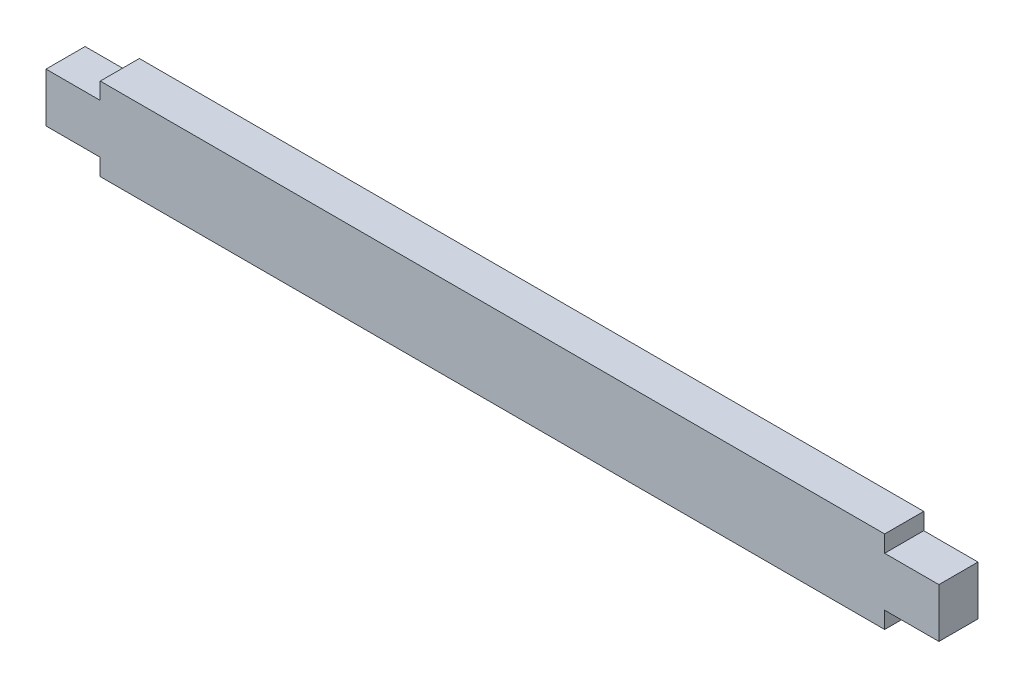
ISO-10303-21;
HEADER;
FILE_DESCRIPTION(('STEP AP214'),'2;1');
FILE_NAME('part.step','',(''),(''),'','','');
FILE_SCHEMA(('AUTOMOTIVE_DESIGN { 1 0 10303 214 1 1 1 1 }'));
ENDSEC;
DATA;
#1=APPLICATION_CONTEXT('core data for automotive mechanical design processes');
#2=APPLICATION_PROTOCOL_DEFINITION('international standard','automotive_design',2000,#1);
#3=PRODUCT_CONTEXT('',#1,'mechanical');
#4=PRODUCT('Part','Part','',(#3));
#5=PRODUCT_RELATED_PRODUCT_CATEGORY('part','',(#4));
#6=PRODUCT_DEFINITION_FORMATION('','',#4);
#7=PRODUCT_DEFINITION_CONTEXT('part definition',#1,'design');
#8=PRODUCT_DEFINITION('design','',#6,#7);
#9=PRODUCT_DEFINITION_SHAPE('','',#8);
#10=(LENGTH_UNIT() NAMED_UNIT(*) SI_UNIT(.MILLI.,.METRE.));
#11=(NAMED_UNIT(*) PLANE_ANGLE_UNIT() SI_UNIT($,.RADIAN.));
#12=(NAMED_UNIT(*) SI_UNIT($,.STERADIAN.) SOLID_ANGLE_UNIT());
#13=UNCERTAINTY_MEASURE_WITH_UNIT(LENGTH_MEASURE(1.E-05),#10,'distance_accuracy_value','');
#14=(GEOMETRIC_REPRESENTATION_CONTEXT(3) GLOBAL_UNCERTAINTY_ASSIGNED_CONTEXT((#13)) GLOBAL_UNIT_ASSIGNED_CONTEXT((#10,
#11,#12)) REPRESENTATION_CONTEXT('',''));
#15=CARTESIAN_POINT('',(0.,0.,0.));
#16=DIRECTION('',(0.,0.,1.));
#17=DIRECTION('',(1.,0.,0.));
#18=AXIS2_PLACEMENT_3D('',#15,#16,#17);
#19=CARTESIAN_POINT('',(-60.185082852189,229.736923892815,43.4894134590924));
#20=DIRECTION('',(1.,0.,0.));
#21=DIRECTION('',(0.,0.,-1.));
#22=AXIS2_PLACEMENT_3D('',#19,#20,#21);
#23=PLANE('',#22);
#24=DIRECTION('',(0.,-1.,0.));
#25=VECTOR('',#24,1.);
#26=CARTESIAN_POINT('',(-60.185082852189,229.736923892815,37.4894134590924));
#27=LINE('',#26,#25);
#28=CARTESIAN_POINT('',(-60.185082852189,232.306808403872,37.4894134590924));
#29=VERTEX_POINT('',#28);
#30=CARTESIAN_POINT('',(-60.185082852189,229.736923892815,37.4894134590924));
#31=VERTEX_POINT('',#30);
#32=EDGE_CURVE('E153',#29,#31,#27,.T.);
#33=ORIENTED_EDGE('',*,*,#32,.T.);
#34=DIRECTION('',(0.,0.,-1.));
#35=VECTOR('',#34,1.);
#36=CARTESIAN_POINT('',(-60.185082852189,229.736923892815,43.4894134590924));
#37=LINE('',#36,#35);
#38=CARTESIAN_POINT('',(-60.185082852189,229.736923892815,43.4894134590924));
#39=VERTEX_POINT('',#38);
#40=EDGE_CURVE('E11',#39,#31,#37,.T.);
#41=ORIENTED_EDGE('',*,*,#40,.F.);
#42=DIRECTION('',(0.,-1.,0.));
#43=VECTOR('',#42,1.);
#44=CARTESIAN_POINT('',(-60.185082852189,229.736923892815,43.4894134590924));
#45=LINE('',#44,#43);
#46=CARTESIAN_POINT('',(-60.185082852189,232.306808403872,43.4894134590924));
#47=VERTEX_POINT('',#46);
#48=EDGE_CURVE('E175',#47,#39,#45,.T.);
#49=ORIENTED_EDGE('',*,*,#48,.F.);
#50=DIRECTION('',(0.,0.,-1.));
#51=VECTOR('',#50,1.);
#52=CARTESIAN_POINT('',(-60.185082852189,232.306808403872,43.4894134590924));
#53=LINE('',#52,#51);
#54=EDGE_CURVE('E149',#47,#29,#53,.T.);
#55=ORIENTED_EDGE('',*,*,#54,.T.);
#56=EDGE_LOOP('',(#33,#41,#49,#55));
#57=FACE_BOUND('',#56,.T.);
#58=ADVANCED_FACE('F33',(#57),#23,.F.);
#59=CARTESIAN_POINT('',(-68.5096381518591,229.736923892815,43.4894134590924));
#60=DIRECTION('',(0.,-1.,0.));
#61=DIRECTION('',(0.,0.,-1.));
#62=AXIS2_PLACEMENT_3D('',#59,#60,#61);
#63=PLANE('',#62);
#64=DIRECTION('',(-1.,0.,0.));
#65=VECTOR('',#64,1.);
#66=CARTESIAN_POINT('',(-68.5096381518591,229.736923892815,37.4894134590924));
#67=LINE('',#66,#65);
#68=CARTESIAN_POINT('',(-68.5096381518591,229.736923892815,37.4894134590924));
#69=VERTEX_POINT('',#68);
#70=EDGE_CURVE('E156',#31,#69,#67,.T.);
#71=ORIENTED_EDGE('',*,*,#70,.T.);
#72=DIRECTION('',(0.,0.,-1.));
#73=VECTOR('',#72,1.);
#74=CARTESIAN_POINT('',(-68.5096381518591,229.736923892815,43.4894134590924));
#75=LINE('',#74,#73);
#76=CARTESIAN_POINT('',(-68.5096381518591,229.736923892815,43.4894134590924));
#77=VERTEX_POINT('',#76);
#78=EDGE_CURVE('E41',#77,#69,#75,.T.);
#79=ORIENTED_EDGE('',*,*,#78,.F.);
#80=DIRECTION('',(-1.,0.,0.));
#81=VECTOR('',#80,1.);
#82=CARTESIAN_POINT('',(-68.5096381518591,229.736923892815,43.4894134590924));
#83=LINE('',#82,#81);
#84=EDGE_CURVE('E104',#39,#77,#83,.T.);
#85=ORIENTED_EDGE('',*,*,#84,.F.);
#86=ORIENTED_EDGE('',*,*,#40,.T.);
#87=EDGE_LOOP('',(#71,#79,#85,#86));
#88=FACE_BOUND('',#87,.T.);
#89=ADVANCED_FACE('F253',(#88),#63,.F.);
#90=CARTESIAN_POINT('',(-68.5096381518591,222.17669291493,43.4894134590924));
#91=DIRECTION('',(1.,0.,0.));
#92=DIRECTION('',(0.,0.,-1.));
#93=AXIS2_PLACEMENT_3D('',#90,#91,#92);
#94=PLANE('',#93);
#95=DIRECTION('',(0.,-1.,0.));
#96=VECTOR('',#95,1.);
#97=CARTESIAN_POINT('',(-68.5096381518591,222.17669291493,37.4894134590924));
#98=LINE('',#97,#96);
#99=CARTESIAN_POINT('',(-68.5096381518591,222.17669291493,37.4894134590924));
#100=VERTEX_POINT('',#99);
#101=EDGE_CURVE('E158',#69,#100,#98,.T.);
#102=ORIENTED_EDGE('',*,*,#101,.T.);
#103=DIRECTION('',(0.,0.,-1.));
#104=VECTOR('',#103,1.);
#105=CARTESIAN_POINT('',(-68.5096381518591,222.17669291493,43.4894134590924));
#106=LINE('',#105,#104);
#107=CARTESIAN_POINT('',(-68.5096381518591,222.17669291493,43.4894134590924));
#108=VERTEX_POINT('',#107);
#109=EDGE_CURVE('E194',#108,#100,#106,.T.);
#110=ORIENTED_EDGE('',*,*,#109,.F.);
#111=DIRECTION('',(0.,-1.,0.));
#112=VECTOR('',#111,1.);
#113=CARTESIAN_POINT('',(-68.5096381518591,222.17669291493,43.4894134590924));
#114=LINE('',#113,#112);
#115=EDGE_CURVE('E202',#77,#108,#114,.T.);
#116=ORIENTED_EDGE('',*,*,#115,.F.);
#117=ORIENTED_EDGE('',*,*,#78,.T.);
#118=EDGE_LOOP('',(#102,#110,#116,#117));
#119=FACE_BOUND('',#118,.T.);
#120=ADVANCED_FACE('F200',(#119),#94,.F.);
#121=CARTESIAN_POINT('',(-60.185082852189,222.17669291493,43.4894134590924));
#122=DIRECTION('',(0.,1.,0.));
#123=DIRECTION('',(0.,0.,1.));
#124=AXIS2_PLACEMENT_3D('',#121,#122,#123);
#125=PLANE('',#124);
#126=DIRECTION('',(1.,0.,0.));
#127=VECTOR('',#126,1.);
#128=CARTESIAN_POINT('',(-60.185082852189,222.17669291493,37.4894134590924));
#129=LINE('',#128,#127);
#130=CARTESIAN_POINT('',(-60.185082852189,222.17669291493,37.4894134590924));
#131=VERTEX_POINT('',#130);
#132=EDGE_CURVE('E160',#100,#131,#129,.T.);
#133=ORIENTED_EDGE('',*,*,#132,.T.);
#134=DIRECTION('',(0.,0.,-1.));
#135=VECTOR('',#134,1.);
#136=CARTESIAN_POINT('',(-60.185082852189,222.17669291493,43.4894134590924));
#137=LINE('',#136,#135);
#138=CARTESIAN_POINT('',(-60.185082852189,222.17669291493,43.4894134590924));
#139=VERTEX_POINT('',#138);
#140=EDGE_CURVE('E191',#139,#131,#137,.T.);
#141=ORIENTED_EDGE('',*,*,#140,.F.);
#142=DIRECTION('',(1.,0.,0.));
#143=VECTOR('',#142,1.);
#144=CARTESIAN_POINT('',(-60.185082852189,222.17669291493,43.4894134590924));
#145=LINE('',#144,#143);
#146=EDGE_CURVE('E220',#108,#139,#145,.T.);
#147=ORIENTED_EDGE('',*,*,#146,.F.);
#148=ORIENTED_EDGE('',*,*,#109,.T.);
#149=EDGE_LOOP('',(#133,#141,#147,#148));
#150=FACE_BOUND('',#149,.T.);
#151=ADVANCED_FACE('F211',(#150),#125,.F.);
#152=CARTESIAN_POINT('',(-60.185082852189,219.606808403872,43.4894134590924));
#153=DIRECTION('',(1.,0.,0.));
#154=DIRECTION('',(0.,0.,-1.));
#155=AXIS2_PLACEMENT_3D('',#152,#153,#154);
#156=PLANE('',#155);
#157=DIRECTION('',(0.,-1.,0.));
#158=VECTOR('',#157,1.);
#159=CARTESIAN_POINT('',(-60.185082852189,219.606808403872,37.4894134590924));
#160=LINE('',#159,#158);
#161=CARTESIAN_POINT('',(-60.185082852189,219.606808403872,37.4894134590924));
#162=VERTEX_POINT('',#161);
#163=EDGE_CURVE('E162',#131,#162,#160,.T.);
#164=ORIENTED_EDGE('',*,*,#163,.T.);
#165=DIRECTION('',(0.,0.,-1.));
#166=VECTOR('',#165,1.);
#167=CARTESIAN_POINT('',(-60.185082852189,219.606808403872,43.4894134590924));
#168=LINE('',#167,#166);
#169=CARTESIAN_POINT('',(-60.185082852189,219.606808403872,43.4894134590924));
#170=VERTEX_POINT('',#169);
#171=EDGE_CURVE('E188',#170,#162,#168,.T.);
#172=ORIENTED_EDGE('',*,*,#171,.F.);
#173=DIRECTION('',(0.,-1.,0.));
#174=VECTOR('',#173,1.);
#175=CARTESIAN_POINT('',(-60.185082852189,219.606808403872,43.4894134590924));
#176=LINE('',#175,#174);
#177=EDGE_CURVE('E217',#139,#170,#176,.T.);
#178=ORIENTED_EDGE('',*,*,#177,.F.);
#179=ORIENTED_EDGE('',*,*,#140,.T.);
#180=EDGE_LOOP('',(#164,#172,#178,#179));
#181=FACE_BOUND('',#180,.T.);
#182=ADVANCED_FACE('F215',(#181),#156,.F.);
#183=CARTESIAN_POINT('',(-60.185082852189,219.606808403872,43.4894134590924));
#184=DIRECTION('',(0.,1.,0.));
#185=DIRECTION('',(0.,0.,1.));
#186=AXIS2_PLACEMENT_3D('',#183,#184,#185);
#187=PLANE('',#186);
#188=DIRECTION('',(1.,0.,0.));
#189=VECTOR('',#188,1.);
#190=CARTESIAN_POINT('',(-60.185082852189,219.606808403872,37.4894134590924));
#191=LINE('',#190,#189);
#192=CARTESIAN_POINT('',(60.185082852189,219.606808403872,37.4894134590924));
#193=VERTEX_POINT('',#192);
#194=EDGE_CURVE('E164',#162,#193,#191,.T.);
#195=ORIENTED_EDGE('',*,*,#194,.T.);
#196=DIRECTION('',(0.,0.,-1.));
#197=VECTOR('',#196,1.);
#198=CARTESIAN_POINT('',(60.185082852189,219.606808403872,43.4894134590924));
#199=LINE('',#198,#197);
#200=CARTESIAN_POINT('',(60.185082852189,219.606808403872,43.4894134590924));
#201=VERTEX_POINT('',#200);
#202=EDGE_CURVE('E185',#201,#193,#199,.T.);
#203=ORIENTED_EDGE('',*,*,#202,.F.);
#204=DIRECTION('',(1.,0.,0.));
#205=VECTOR('',#204,1.);
#206=CARTESIAN_POINT('',(-60.185082852189,219.606808403872,43.4894134590924));
#207=LINE('',#206,#205);
#208=EDGE_CURVE('E219',#170,#201,#207,.T.);
#209=ORIENTED_EDGE('',*,*,#208,.F.);
#210=ORIENTED_EDGE('',*,*,#171,.T.);
#211=EDGE_LOOP('',(#195,#203,#209,#210));
#212=FACE_BOUND('',#211,.T.);
#213=ADVANCED_FACE('F266',(#212),#187,.F.);
#214=CARTESIAN_POINT('',(60.185082852189,219.606808403872,43.4894134590924));
#215=DIRECTION('',(-1.,0.,0.));
#216=DIRECTION('',(0.,0.,1.));
#217=AXIS2_PLACEMENT_3D('',#214,#215,#216);
#218=PLANE('',#217);
#219=DIRECTION('',(0.,1.,0.));
#220=VECTOR('',#219,1.);
#221=CARTESIAN_POINT('',(60.185082852189,219.606808403872,37.4894134590924));
#222=LINE('',#221,#220);
#223=CARTESIAN_POINT('',(60.185082852189,222.17669291493,37.4894134590924));
#224=VERTEX_POINT('',#223);
#225=EDGE_CURVE('E166',#193,#224,#222,.T.);
#226=ORIENTED_EDGE('',*,*,#225,.T.);
#227=DIRECTION('',(0.,0.,-1.));
#228=VECTOR('',#227,1.);
#229=CARTESIAN_POINT('',(60.185082852189,222.17669291493,43.4894134590924));
#230=LINE('',#229,#228);
#231=CARTESIAN_POINT('',(60.185082852189,222.17669291493,43.4894134590924));
#232=VERTEX_POINT('',#231);
#233=EDGE_CURVE('E182',#232,#224,#230,.T.);
#234=ORIENTED_EDGE('',*,*,#233,.F.);
#235=DIRECTION('',(0.,1.,0.));
#236=VECTOR('',#235,1.);
#237=CARTESIAN_POINT('',(60.185082852189,219.606808403872,43.4894134590924));
#238=LINE('',#237,#236);
#239=EDGE_CURVE('E222',#201,#232,#238,.T.);
#240=ORIENTED_EDGE('',*,*,#239,.F.);
#241=ORIENTED_EDGE('',*,*,#202,.T.);
#242=EDGE_LOOP('',(#226,#234,#240,#241));
#243=FACE_BOUND('',#242,.T.);
#244=ADVANCED_FACE('F269',(#243),#218,.F.);
#245=CARTESIAN_POINT('',(60.185082852189,222.17669291493,43.4894134590924));
#246=DIRECTION('',(0.,1.,0.));
#247=DIRECTION('',(0.,0.,1.));
#248=AXIS2_PLACEMENT_3D('',#245,#246,#247);
#249=PLANE('',#248);
#250=DIRECTION('',(1.,0.,0.));
#251=VECTOR('',#250,1.);
#252=CARTESIAN_POINT('',(60.185082852189,222.17669291493,37.4894134590924));
#253=LINE('',#252,#251);
#254=CARTESIAN_POINT('',(68.5096381518591,222.17669291493,37.4894134590924));
#255=VERTEX_POINT('',#254);
#256=EDGE_CURVE('E168',#224,#255,#253,.T.);
#257=ORIENTED_EDGE('',*,*,#256,.T.);
#258=DIRECTION('',(0.,0.,-1.));
#259=VECTOR('',#258,1.);
#260=CARTESIAN_POINT('',(68.5096381518591,222.17669291493,43.4894134590924));
#261=LINE('',#260,#259);
#262=CARTESIAN_POINT('',(68.5096381518591,222.17669291493,43.4894134590924));
#263=VERTEX_POINT('',#262);
#264=EDGE_CURVE('E179',#263,#255,#261,.T.);
#265=ORIENTED_EDGE('',*,*,#264,.F.);
#266=DIRECTION('',(1.,0.,0.));
#267=VECTOR('',#266,1.);
#268=CARTESIAN_POINT('',(60.185082852189,222.17669291493,43.4894134590924));
#269=LINE('',#268,#267);
#270=EDGE_CURVE('E228',#232,#263,#269,.T.);
#271=ORIENTED_EDGE('',*,*,#270,.F.);
#272=ORIENTED_EDGE('',*,*,#233,.T.);
#273=EDGE_LOOP('',(#257,#265,#271,#272));
#274=FACE_BOUND('',#273,.T.);
#275=ADVANCED_FACE('F234',(#274),#249,.F.);
#276=CARTESIAN_POINT('',(68.5096381518591,222.17669291493,43.4894134590924));
#277=DIRECTION('',(-1.,0.,0.));
#278=DIRECTION('',(0.,0.,1.));
#279=AXIS2_PLACEMENT_3D('',#276,#277,#278);
#280=PLANE('',#279);
#281=DIRECTION('',(0.,1.,0.));
#282=VECTOR('',#281,1.);
#283=CARTESIAN_POINT('',(68.5096381518591,222.17669291493,37.4894134590924));
#284=LINE('',#283,#282);
#285=CARTESIAN_POINT('',(68.5096381518591,229.736923892815,37.4894134590924));
#286=VERTEX_POINT('',#285);
#287=EDGE_CURVE('E170',#255,#286,#284,.T.);
#288=ORIENTED_EDGE('',*,*,#287,.T.);
#289=DIRECTION('',(0.,0.,-1.));
#290=VECTOR('',#289,1.);
#291=CARTESIAN_POINT('',(68.5096381518591,229.736923892815,43.4894134590924));
#292=LINE('',#291,#290);
#293=CARTESIAN_POINT('',(68.5096381518591,229.736923892815,43.4894134590924));
#294=VERTEX_POINT('',#293);
#295=EDGE_CURVE('E144',#294,#286,#292,.T.);
#296=ORIENTED_EDGE('',*,*,#295,.F.);
#297=DIRECTION('',(0.,1.,0.));
#298=VECTOR('',#297,1.);
#299=CARTESIAN_POINT('',(68.5096381518591,222.17669291493,43.4894134590924));
#300=LINE('',#299,#298);
#301=EDGE_CURVE('E135',#263,#294,#300,.T.);
#302=ORIENTED_EDGE('',*,*,#301,.F.);
#303=ORIENTED_EDGE('',*,*,#264,.T.);
#304=EDGE_LOOP('',(#288,#296,#302,#303));
#305=FACE_BOUND('',#304,.T.);
#306=ADVANCED_FACE('F238',(#305),#280,.F.);
#307=CARTESIAN_POINT('',(60.185082852189,229.736923892815,43.4894134590924));
#308=DIRECTION('',(0.,-1.,0.));
#309=DIRECTION('',(0.,0.,-1.));
#310=AXIS2_PLACEMENT_3D('',#307,#308,#309);
#311=PLANE('',#310);
#312=DIRECTION('',(-1.,0.,0.));
#313=VECTOR('',#312,1.);
#314=CARTESIAN_POINT('',(60.185082852189,229.736923892815,37.4894134590924));
#315=LINE('',#314,#313);
#316=CARTESIAN_POINT('',(60.185082852189,229.736923892815,37.4894134590924));
#317=VERTEX_POINT('',#316);
#318=EDGE_CURVE('E143',#286,#317,#315,.T.);
#319=ORIENTED_EDGE('',*,*,#318,.T.);
#320=DIRECTION('',(0.,0.,-1.));
#321=VECTOR('',#320,1.);
#322=CARTESIAN_POINT('',(60.185082852189,229.736923892815,43.4894134590924));
#323=LINE('',#322,#321);
#324=CARTESIAN_POINT('',(60.185082852189,229.736923892815,43.4894134590924));
#325=VERTEX_POINT('',#324);
#326=EDGE_CURVE('E140',#325,#317,#323,.T.);
#327=ORIENTED_EDGE('',*,*,#326,.F.);
#328=DIRECTION('',(-1.,0.,0.));
#329=VECTOR('',#328,1.);
#330=CARTESIAN_POINT('',(60.185082852189,229.736923892815,43.4894134590924));
#331=LINE('',#330,#329);
#332=EDGE_CURVE('E129',#294,#325,#331,.T.);
#333=ORIENTED_EDGE('',*,*,#332,.F.);
#334=ORIENTED_EDGE('',*,*,#295,.T.);
#335=EDGE_LOOP('',(#319,#327,#333,#334));
#336=FACE_BOUND('',#335,.T.);
#337=ADVANCED_FACE('F141',(#336),#311,.F.);
#338=CARTESIAN_POINT('',(60.185082852189,232.306808403872,43.4894134590924));
#339=DIRECTION('',(-1.,0.,0.));
#340=DIRECTION('',(0.,0.,1.));
#341=AXIS2_PLACEMENT_3D('',#338,#339,#340);
#342=PLANE('',#341);
#343=DIRECTION('',(0.,1.,0.));
#344=VECTOR('',#343,1.);
#345=CARTESIAN_POINT('',(60.185082852189,232.306808403872,37.4894134590924));
#346=LINE('',#345,#344);
#347=CARTESIAN_POINT('',(60.185082852189,232.306808403872,37.4894134590924));
#348=VERTEX_POINT('',#347);
#349=EDGE_CURVE('E90',#317,#348,#346,.T.);
#350=ORIENTED_EDGE('',*,*,#349,.T.);
#351=DIRECTION('',(0.,0.,-1.));
#352=VECTOR('',#351,1.);
#353=CARTESIAN_POINT('',(60.185082852189,232.306808403872,43.4894134590924));
#354=LINE('',#353,#352);
#355=CARTESIAN_POINT('',(60.185082852189,232.306808403872,43.4894134590924));
#356=VERTEX_POINT('',#355);
#357=EDGE_CURVE('E145',#356,#348,#354,.T.);
#358=ORIENTED_EDGE('',*,*,#357,.F.);
#359=DIRECTION('',(0.,1.,0.));
#360=VECTOR('',#359,1.);
#361=CARTESIAN_POINT('',(60.185082852189,232.306808403872,43.4894134590924));
#362=LINE('',#361,#360);
#363=EDGE_CURVE('E133',#325,#356,#362,.T.);
#364=ORIENTED_EDGE('',*,*,#363,.F.);
#365=ORIENTED_EDGE('',*,*,#326,.T.);
#366=EDGE_LOOP('',(#350,#358,#364,#365));
#367=FACE_BOUND('',#366,.T.);
#368=ADVANCED_FACE('F147',(#367),#342,.F.);
#369=CARTESIAN_POINT('',(-60.185082852189,232.306808403872,43.4894134590924));
#370=DIRECTION('',(0.,-1.,0.));
#371=DIRECTION('',(0.,0.,-1.));
#372=AXIS2_PLACEMENT_3D('',#369,#370,#371);
#373=PLANE('',#372);
#374=DIRECTION('',(-1.,0.,0.));
#375=VECTOR('',#374,1.);
#376=CARTESIAN_POINT('',(-60.185082852189,232.306808403872,37.4894134590924));
#377=LINE('',#376,#375);
#378=EDGE_CURVE('E96',#348,#29,#377,.T.);
#379=ORIENTED_EDGE('',*,*,#378,.T.);
#380=ORIENTED_EDGE('',*,*,#54,.F.);
#381=DIRECTION('',(-1.,0.,0.));
#382=VECTOR('',#381,1.);
#383=CARTESIAN_POINT('',(-60.185082852189,232.306808403872,43.4894134590924));
#384=LINE('',#383,#382);
#385=EDGE_CURVE('E49',#356,#47,#384,.T.);
#386=ORIENTED_EDGE('',*,*,#385,.F.);
#387=ORIENTED_EDGE('',*,*,#357,.T.);
#388=EDGE_LOOP('',(#379,#380,#386,#387));
#389=FACE_BOUND('',#388,.T.);
#390=ADVANCED_FACE('F242',(#389),#373,.F.);
#391=CARTESIAN_POINT('',(0.,0.,43.4894134590924));
#392=DIRECTION('',(0.,0.,-1.));
#393=DIRECTION('',(-1.,0.,0.));
#394=AXIS2_PLACEMENT_3D('',#391,#392,#393);
#395=PLANE('',#394);
#396=ORIENTED_EDGE('',*,*,#48,.T.);
#397=ORIENTED_EDGE('',*,*,#84,.T.);
#398=ORIENTED_EDGE('',*,*,#115,.T.);
#399=ORIENTED_EDGE('',*,*,#146,.T.);
#400=ORIENTED_EDGE('',*,*,#177,.T.);
#401=ORIENTED_EDGE('',*,*,#208,.T.);
#402=ORIENTED_EDGE('',*,*,#239,.T.);
#403=ORIENTED_EDGE('',*,*,#270,.T.);
#404=ORIENTED_EDGE('',*,*,#301,.T.);
#405=ORIENTED_EDGE('',*,*,#332,.T.);
#406=ORIENTED_EDGE('',*,*,#363,.T.);
#407=ORIENTED_EDGE('',*,*,#385,.T.);
#408=EDGE_LOOP('',(#396,#397,#398,#399,#400,#401,#402,#403,#404,#405,#406,#407));
#409=FACE_BOUND('',#408,.T.);
#410=ADVANCED_FACE('F131',(#409),#395,.F.);
#411=CARTESIAN_POINT('',(0.,0.,37.4894134590924));
#412=DIRECTION('',(0.,0.,-1.));
#413=DIRECTION('',(-1.,0.,0.));
#414=AXIS2_PLACEMENT_3D('',#411,#412,#413);
#415=PLANE('',#414);
#416=ORIENTED_EDGE('',*,*,#32,.F.);
#417=ORIENTED_EDGE('',*,*,#378,.F.);
#418=ORIENTED_EDGE('',*,*,#349,.F.);
#419=ORIENTED_EDGE('',*,*,#318,.F.);
#420=ORIENTED_EDGE('',*,*,#287,.F.);
#421=ORIENTED_EDGE('',*,*,#256,.F.);
#422=ORIENTED_EDGE('',*,*,#225,.F.);
#423=ORIENTED_EDGE('',*,*,#194,.F.);
#424=ORIENTED_EDGE('',*,*,#163,.F.);
#425=ORIENTED_EDGE('',*,*,#132,.F.);
#426=ORIENTED_EDGE('',*,*,#101,.F.);
#427=ORIENTED_EDGE('',*,*,#70,.F.);
#428=EDGE_LOOP('',(#416,#417,#418,#419,#420,#421,#422,#423,#424,#425,#426,#427));
#429=FACE_BOUND('',#428,.T.);
#430=ADVANCED_FACE('F206',(#429),#415,.T.);
#431=CLOSED_SHELL('',(#58,#89,#120,#151,#182,#213,#244,#275,#306,#337,#368,#390,#410,#430));
#432=MANIFOLD_SOLID_BREP('B2',#431);
#433=ADVANCED_BREP_SHAPE_REPRESENTATION('',(#18,#432),#14);
#434=SHAPE_DEFINITION_REPRESENTATION(#9,#433);
ENDSEC;
END-ISO-10303-21;
